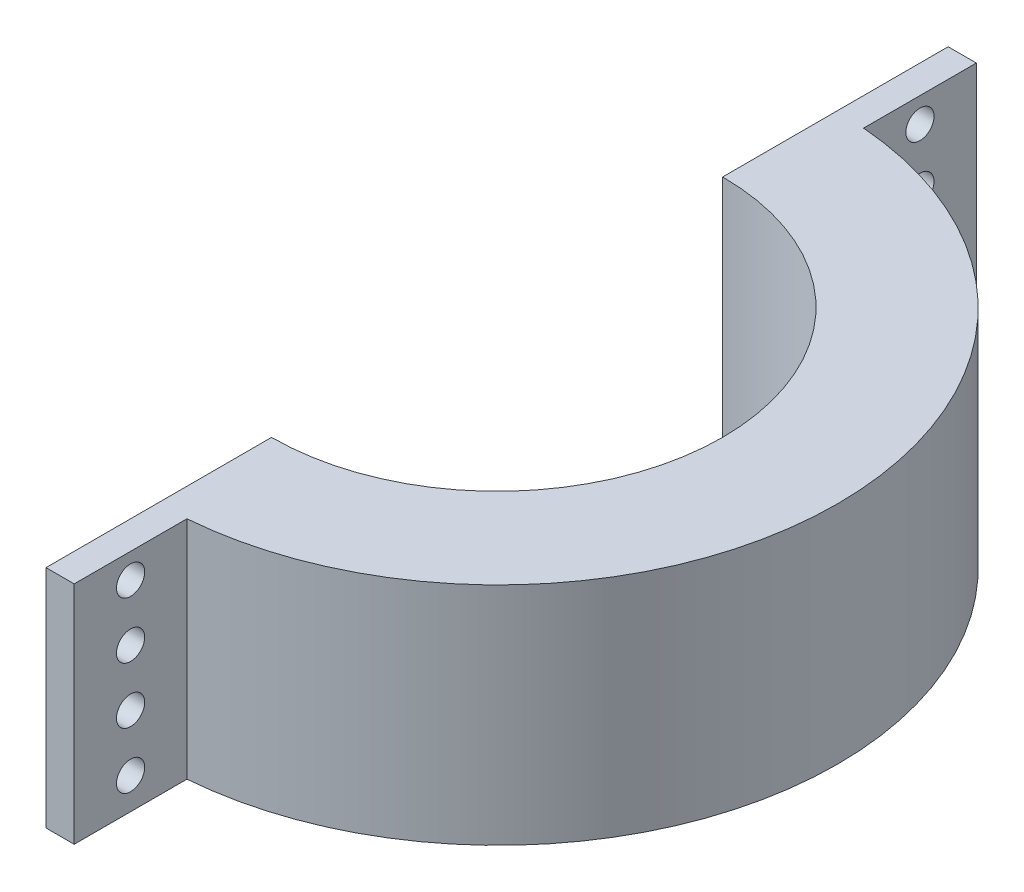
ISO-10303-21;
HEADER;
FILE_DESCRIPTION(('STEP AP214'),'2;1');
FILE_NAME('part.step','',(''),(''),'','','');
FILE_SCHEMA(('AUTOMOTIVE_DESIGN { 1 0 10303 214 1 1 1 1 }'));
ENDSEC;
DATA;
#1=APPLICATION_CONTEXT('core data for automotive mechanical design processes');
#2=APPLICATION_PROTOCOL_DEFINITION('international standard','automotive_design',2000,#1);
#3=PRODUCT_CONTEXT('',#1,'mechanical');
#4=PRODUCT('Part','Part','',(#3));
#5=PRODUCT_RELATED_PRODUCT_CATEGORY('part','',(#4));
#6=PRODUCT_DEFINITION_FORMATION('','',#4);
#7=PRODUCT_DEFINITION_CONTEXT('part definition',#1,'design');
#8=PRODUCT_DEFINITION('design','',#6,#7);
#9=PRODUCT_DEFINITION_SHAPE('','',#8);
#10=(LENGTH_UNIT() NAMED_UNIT(*) SI_UNIT(.MILLI.,.METRE.));
#11=(NAMED_UNIT(*) PLANE_ANGLE_UNIT() SI_UNIT($,.RADIAN.));
#12=(NAMED_UNIT(*) SI_UNIT($,.STERADIAN.) SOLID_ANGLE_UNIT());
#13=UNCERTAINTY_MEASURE_WITH_UNIT(LENGTH_MEASURE(1.E-05),#10,'distance_accuracy_value','');
#14=(GEOMETRIC_REPRESENTATION_CONTEXT(3) GLOBAL_UNCERTAINTY_ASSIGNED_CONTEXT((#13)) GLOBAL_UNIT_ASSIGNED_CONTEXT((#10,
#11,#12)) REPRESENTATION_CONTEXT('',''));
#15=CARTESIAN_POINT('',(0.,0.,0.));
#16=DIRECTION('',(0.,0.,1.));
#17=DIRECTION('',(1.,0.,0.));
#18=AXIS2_PLACEMENT_3D('',#15,#16,#17);
#19=CARTESIAN_POINT('',(0.,101.6,0.));
#20=DIRECTION('',(0.,-1.,0.));
#21=DIRECTION('',(0.,0.,-1.));
#22=AXIS2_PLACEMENT_3D('',#19,#20,#21);
#23=CYLINDRICAL_SURFACE('',#22,101.6);
#24=CARTESIAN_POINT('',(0.,0.,0.));
#25=DIRECTION('',(0.,-1.,0.));
#26=DIRECTION('',(0.,0.,-1.));
#27=AXIS2_PLACEMENT_3D('',#24,#25,#26);
#28=CIRCLE('',#27,101.6);
#29=CARTESIAN_POINT('',(0.,0.,-101.6));
#30=VERTEX_POINT('',#29);
#31=CARTESIAN_POINT('',(0.,0.,101.6));
#32=VERTEX_POINT('',#31);
#33=EDGE_CURVE('E132',#30,#32,#28,.T.);
#34=ORIENTED_EDGE('',*,*,#33,.T.);
#35=DIRECTION('',(0.,-1.,0.));
#36=VECTOR('',#35,1.);
#37=CARTESIAN_POINT('',(0.,101.6,101.6));
#38=LINE('',#37,#36);
#39=CARTESIAN_POINT('',(0.,101.6,101.6));
#40=VERTEX_POINT('',#39);
#41=EDGE_CURVE('E11',#40,#32,#38,.T.);
#42=ORIENTED_EDGE('',*,*,#41,.F.);
#43=CARTESIAN_POINT('',(0.,101.6,0.));
#44=DIRECTION('',(0.,-1.,0.));
#45=DIRECTION('',(0.,0.,-1.));
#46=AXIS2_PLACEMENT_3D('',#43,#44,#45);
#47=CIRCLE('',#46,101.6);
#48=CARTESIAN_POINT('',(0.,101.6,-101.6));
#49=VERTEX_POINT('',#48);
#50=EDGE_CURVE('E147',#49,#40,#47,.T.);
#51=ORIENTED_EDGE('',*,*,#50,.F.);
#52=DIRECTION('',(0.,-1.,0.));
#53=VECTOR('',#52,1.);
#54=CARTESIAN_POINT('',(0.,101.6,-101.6));
#55=LINE('',#54,#53);
#56=EDGE_CURVE('E128',#49,#30,#55,.T.);
#57=ORIENTED_EDGE('',*,*,#56,.T.);
#58=EDGE_LOOP('',(#34,#42,#51,#57));
#59=FACE_BOUND('',#58,.T.);
#60=ADVANCED_FACE('F36',(#59),#23,.F.);
#61=CARTESIAN_POINT('',(0.,101.6,101.6));
#62=DIRECTION('',(1.,0.,0.));
#63=DIRECTION('',(0.,0.,-1.));
#64=AXIS2_PLACEMENT_3D('',#61,#62,#63);
#65=PLANE('',#64);
#66=CARTESIAN_POINT('',(0.,14.1803216621523,177.799999999999));
#67=DIRECTION('',(1.,0.,0.));
#68=DIRECTION('',(0.,0.,-1.));
#69=AXIS2_PLACEMENT_3D('',#66,#67,#68);
#70=CIRCLE('',#69,6.34999999999999);
#71=CARTESIAN_POINT('',(0.,14.1803216621523,171.449999999999));
#72=VERTEX_POINT('',#71);
#73=EDGE_CURVE('E195',#72,#72,#70,.T.);
#74=ORIENTED_EDGE('',*,*,#73,.T.);
#75=EDGE_LOOP('',(#74));
#76=FACE_BOUND('',#75,.T.);
#77=CARTESIAN_POINT('',(0.,39.5803216621523,177.799999999999));
#78=DIRECTION('',(1.,0.,0.));
#79=DIRECTION('',(0.,0.,-1.));
#80=AXIS2_PLACEMENT_3D('',#77,#78,#79);
#81=CIRCLE('',#80,6.34999999999999);
#82=CARTESIAN_POINT('',(0.,39.5803216621523,171.449999999999));
#83=VERTEX_POINT('',#82);
#84=EDGE_CURVE('E189',#83,#83,#81,.T.);
#85=ORIENTED_EDGE('',*,*,#84,.T.);
#86=EDGE_LOOP('',(#85));
#87=FACE_BOUND('',#86,.T.);
#88=CARTESIAN_POINT('',(0.,64.9803216621523,177.8));
#89=DIRECTION('',(1.,0.,0.));
#90=DIRECTION('',(0.,0.,-1.));
#91=AXIS2_PLACEMENT_3D('',#88,#89,#90);
#92=CIRCLE('',#91,6.34999999999999);
#93=CARTESIAN_POINT('',(0.,64.9803216621523,171.45));
#94=VERTEX_POINT('',#93);
#95=EDGE_CURVE('E183',#94,#94,#92,.T.);
#96=ORIENTED_EDGE('',*,*,#95,.T.);
#97=EDGE_LOOP('',(#96));
#98=FACE_BOUND('',#97,.T.);
#99=CARTESIAN_POINT('',(0.,90.3803216621523,177.8));
#100=DIRECTION('',(1.,0.,0.));
#101=DIRECTION('',(0.,0.,-1.));
#102=AXIS2_PLACEMENT_3D('',#99,#100,#101);
#103=CIRCLE('',#102,6.34999999999999);
#104=CARTESIAN_POINT('',(0.,90.3803216621523,171.45));
#105=VERTEX_POINT('',#104);
#106=EDGE_CURVE('E136',#105,#105,#103,.T.);
#107=ORIENTED_EDGE('',*,*,#106,.T.);
#108=EDGE_LOOP('',(#107));
#109=FACE_BOUND('',#108,.T.);
#110=DIRECTION('',(0.,0.,1.));
#111=VECTOR('',#110,1.);
#112=CARTESIAN_POINT('',(0.,0.,101.6));
#113=LINE('',#112,#111);
#114=CARTESIAN_POINT('',(0.,0.,203.2));
#115=VERTEX_POINT('',#114);
#116=EDGE_CURVE('E135',#32,#115,#113,.T.);
#117=ORIENTED_EDGE('',*,*,#116,.T.);
#118=DIRECTION('',(0.,-1.,0.));
#119=VECTOR('',#118,1.);
#120=CARTESIAN_POINT('',(0.,101.6,203.2));
#121=LINE('',#120,#119);
#122=CARTESIAN_POINT('',(0.,101.6,203.2));
#123=VERTEX_POINT('',#122);
#124=EDGE_CURVE('E44',#123,#115,#121,.T.);
#125=ORIENTED_EDGE('',*,*,#124,.F.);
#126=DIRECTION('',(0.,0.,1.));
#127=VECTOR('',#126,1.);
#128=CARTESIAN_POINT('',(0.,101.6,101.6));
#129=LINE('',#128,#127);
#130=EDGE_CURVE('E95',#40,#123,#129,.T.);
#131=ORIENTED_EDGE('',*,*,#130,.F.);
#132=ORIENTED_EDGE('',*,*,#41,.T.);
#133=EDGE_LOOP('',(#117,#125,#131,#132));
#134=FACE_BOUND('',#133,.T.);
#135=ADVANCED_FACE('F264',(#76,#87,#98,#109,#134),#65,.F.);
#136=CARTESIAN_POINT('',(0.,101.6,203.2));
#137=DIRECTION('',(0.,0.,-1.));
#138=DIRECTION('',(-1.,0.,0.));
#139=AXIS2_PLACEMENT_3D('',#136,#137,#138);
#140=PLANE('',#139);
#141=DIRECTION('',(1.,0.,0.));
#142=VECTOR('',#141,1.);
#143=CARTESIAN_POINT('',(0.,0.,203.2));
#144=LINE('',#143,#142);
#145=CARTESIAN_POINT('',(12.7,0.,203.2));
#146=VERTEX_POINT('',#145);
#147=EDGE_CURVE('E138',#115,#146,#144,.T.);
#148=ORIENTED_EDGE('',*,*,#147,.T.);
#149=DIRECTION('',(0.,-1.,0.));
#150=VECTOR('',#149,1.);
#151=CARTESIAN_POINT('',(12.7,101.6,203.2));
#152=LINE('',#151,#150);
#153=CARTESIAN_POINT('',(12.7,101.6,203.2));
#154=VERTEX_POINT('',#153);
#155=EDGE_CURVE('E154',#154,#146,#152,.T.);
#156=ORIENTED_EDGE('',*,*,#155,.F.);
#157=DIRECTION('',(1.,0.,0.));
#158=VECTOR('',#157,1.);
#159=CARTESIAN_POINT('',(0.,101.6,203.2));
#160=LINE('',#159,#158);
#161=EDGE_CURVE('E162',#123,#154,#160,.T.);
#162=ORIENTED_EDGE('',*,*,#161,.F.);
#163=ORIENTED_EDGE('',*,*,#124,.T.);
#164=EDGE_LOOP('',(#148,#156,#162,#163));
#165=FACE_BOUND('',#164,.T.);
#166=ADVANCED_FACE('F160',(#165),#140,.F.);
#167=CARTESIAN_POINT('',(12.7,101.6,203.2));
#168=DIRECTION('',(-1.,0.,0.));
#169=DIRECTION('',(0.,0.,1.));
#170=AXIS2_PLACEMENT_3D('',#167,#168,#169);
#171=PLANE('',#170);
#172=CARTESIAN_POINT('',(12.7,14.1803216621523,177.799999999999));
#173=DIRECTION('',(1.,0.,0.));
#174=DIRECTION('',(0.,0.,-1.));
#175=AXIS2_PLACEMENT_3D('',#172,#173,#174);
#176=CIRCLE('',#175,6.34999999999999);
#177=CARTESIAN_POINT('',(12.7,14.1803216621523,171.449999999999));
#178=VERTEX_POINT('',#177);
#179=EDGE_CURVE('E198',#178,#178,#176,.T.);
#180=ORIENTED_EDGE('',*,*,#179,.F.);
#181=EDGE_LOOP('',(#180));
#182=FACE_BOUND('',#181,.T.);
#183=CARTESIAN_POINT('',(12.7,39.5803216621523,177.799999999999));
#184=DIRECTION('',(1.,0.,0.));
#185=DIRECTION('',(0.,0.,-1.));
#186=AXIS2_PLACEMENT_3D('',#183,#184,#185);
#187=CIRCLE('',#186,6.34999999999999);
#188=CARTESIAN_POINT('',(12.7,39.5803216621523,171.449999999999));
#189=VERTEX_POINT('',#188);
#190=EDGE_CURVE('E192',#189,#189,#187,.T.);
#191=ORIENTED_EDGE('',*,*,#190,.F.);
#192=EDGE_LOOP('',(#191));
#193=FACE_BOUND('',#192,.T.);
#194=CARTESIAN_POINT('',(12.7,64.9803216621523,177.8));
#195=DIRECTION('',(1.,0.,0.));
#196=DIRECTION('',(0.,0.,-1.));
#197=AXIS2_PLACEMENT_3D('',#194,#195,#196);
#198=CIRCLE('',#197,6.34999999999999);
#199=CARTESIAN_POINT('',(12.7,64.9803216621523,171.45));
#200=VERTEX_POINT('',#199);
#201=EDGE_CURVE('E186',#200,#200,#198,.T.);
#202=ORIENTED_EDGE('',*,*,#201,.F.);
#203=EDGE_LOOP('',(#202));
#204=FACE_BOUND('',#203,.T.);
#205=CARTESIAN_POINT('',(12.7,90.3803216621523,177.8));
#206=DIRECTION('',(1.,0.,0.));
#207=DIRECTION('',(0.,0.,-1.));
#208=AXIS2_PLACEMENT_3D('',#205,#206,#207);
#209=CIRCLE('',#208,6.34999999999999);
#210=CARTESIAN_POINT('',(12.7,90.3803216621523,171.45));
#211=VERTEX_POINT('',#210);
#212=EDGE_CURVE('E180',#211,#211,#209,.T.);
#213=ORIENTED_EDGE('',*,*,#212,.F.);
#214=EDGE_LOOP('',(#213));
#215=FACE_BOUND('',#214,.T.);
#216=DIRECTION('',(0.,0.,-1.));
#217=VECTOR('',#216,1.);
#218=CARTESIAN_POINT('',(12.7,0.,203.2));
#219=LINE('',#218,#217);
#220=CARTESIAN_POINT('',(12.7,0.,152.4));
#221=VERTEX_POINT('',#220);
#222=EDGE_CURVE('E140',#146,#221,#219,.T.);
#223=ORIENTED_EDGE('',*,*,#222,.T.);
#224=DIRECTION('',(0.,-1.,0.));
#225=VECTOR('',#224,1.);
#226=CARTESIAN_POINT('',(12.7,101.6,152.4));
#227=LINE('',#226,#225);
#228=CARTESIAN_POINT('',(12.7,101.6,152.4));
#229=VERTEX_POINT('',#228);
#230=EDGE_CURVE('E151',#229,#221,#227,.T.);
#231=ORIENTED_EDGE('',*,*,#230,.F.);
#232=DIRECTION('',(0.,0.,-1.));
#233=VECTOR('',#232,1.);
#234=CARTESIAN_POINT('',(12.7,101.6,203.2));
#235=LINE('',#234,#233);
#236=EDGE_CURVE('E174',#154,#229,#235,.T.);
#237=ORIENTED_EDGE('',*,*,#236,.F.);
#238=ORIENTED_EDGE('',*,*,#155,.T.);
#239=EDGE_LOOP('',(#223,#231,#237,#238));
#240=FACE_BOUND('',#239,.T.);
#241=ADVANCED_FACE('F170',(#182,#193,#204,#215,#240),#171,.F.);
#242=CARTESIAN_POINT('',(0.517193605257081,101.6,0.));
#243=DIRECTION('',(0.,-1.,0.));
#244=DIRECTION('',(0.,0.,-1.));
#245=AXIS2_PLACEMENT_3D('',#242,#243,#244);
#246=CYLINDRICAL_SURFACE('',#245,152.886169327548);
#247=CARTESIAN_POINT('',(0.517193605257081,0.,0.));
#248=DIRECTION('',(0.,1.,0.));
#249=DIRECTION('',(0.,0.,-1.));
#250=AXIS2_PLACEMENT_3D('',#247,#248,#249);
#251=CIRCLE('',#250,152.886169327548);
#252=CARTESIAN_POINT('',(12.7,0.,-152.4));
#253=VERTEX_POINT('',#252);
#254=EDGE_CURVE('E142',#221,#253,#251,.T.);
#255=ORIENTED_EDGE('',*,*,#254,.T.);
#256=DIRECTION('',(0.,-1.,0.));
#257=VECTOR('',#256,1.);
#258=CARTESIAN_POINT('',(12.7,101.6,-152.4));
#259=LINE('',#258,#257);
#260=CARTESIAN_POINT('',(12.7,101.6,-152.4));
#261=VERTEX_POINT('',#260);
#262=EDGE_CURVE('E123',#261,#253,#259,.T.);
#263=ORIENTED_EDGE('',*,*,#262,.F.);
#264=CARTESIAN_POINT('',(0.517193605257081,101.6,0.));
#265=DIRECTION('',(0.,1.,0.));
#266=DIRECTION('',(0.,0.,-1.));
#267=AXIS2_PLACEMENT_3D('',#264,#265,#266);
#268=CIRCLE('',#267,152.886169327548);
#269=EDGE_CURVE('E114',#229,#261,#268,.T.);
#270=ORIENTED_EDGE('',*,*,#269,.F.);
#271=ORIENTED_EDGE('',*,*,#230,.T.);
#272=EDGE_LOOP('',(#255,#263,#270,#271));
#273=FACE_BOUND('',#272,.T.);
#274=ADVANCED_FACE('F173',(#273),#246,.T.);
#275=CARTESIAN_POINT('',(12.7,101.6,-203.2));
#276=DIRECTION('',(-1.,0.,0.));
#277=DIRECTION('',(0.,0.,1.));
#278=AXIS2_PLACEMENT_3D('',#275,#276,#277);
#279=PLANE('',#278);
#280=CARTESIAN_POINT('',(12.7,14.1803216621523,-177.800000000001));
#281=DIRECTION('',(1.,0.,0.));
#282=DIRECTION('',(0.,0.,-1.));
#283=AXIS2_PLACEMENT_3D('',#280,#281,#282);
#284=CIRCLE('',#283,6.34999999999999);
#285=CARTESIAN_POINT('',(12.7,14.1803216621523,-184.150000000001));
#286=VERTEX_POINT('',#285);
#287=EDGE_CURVE('E222',#286,#286,#284,.T.);
#288=ORIENTED_EDGE('',*,*,#287,.F.);
#289=EDGE_LOOP('',(#288));
#290=FACE_BOUND('',#289,.T.);
#291=CARTESIAN_POINT('',(12.7,39.5803216621523,-177.800000000001));
#292=DIRECTION('',(1.,0.,0.));
#293=DIRECTION('',(0.,0.,-1.));
#294=AXIS2_PLACEMENT_3D('',#291,#292,#293);
#295=CIRCLE('',#294,6.34999999999999);
#296=CARTESIAN_POINT('',(12.7,39.5803216621523,-184.150000000001));
#297=VERTEX_POINT('',#296);
#298=EDGE_CURVE('E216',#297,#297,#295,.T.);
#299=ORIENTED_EDGE('',*,*,#298,.F.);
#300=EDGE_LOOP('',(#299));
#301=FACE_BOUND('',#300,.T.);
#302=CARTESIAN_POINT('',(12.7,64.9803216621523,-177.8));
#303=DIRECTION('',(1.,0.,0.));
#304=DIRECTION('',(0.,0.,-1.));
#305=AXIS2_PLACEMENT_3D('',#302,#303,#304);
#306=CIRCLE('',#305,6.34999999999999);
#307=CARTESIAN_POINT('',(12.7,64.9803216621523,-184.15));
#308=VERTEX_POINT('',#307);
#309=EDGE_CURVE('E210',#308,#308,#306,.T.);
#310=ORIENTED_EDGE('',*,*,#309,.F.);
#311=EDGE_LOOP('',(#310));
#312=FACE_BOUND('',#311,.T.);
#313=CARTESIAN_POINT('',(12.7,90.3803216621523,-177.8));
#314=DIRECTION('',(1.,0.,0.));
#315=DIRECTION('',(0.,0.,-1.));
#316=AXIS2_PLACEMENT_3D('',#313,#314,#315);
#317=CIRCLE('',#316,6.34999999999999);
#318=CARTESIAN_POINT('',(12.7,90.3803216621523,-184.15));
#319=VERTEX_POINT('',#318);
#320=EDGE_CURVE('E204',#319,#319,#317,.T.);
#321=ORIENTED_EDGE('',*,*,#320,.F.);
#322=EDGE_LOOP('',(#321));
#323=FACE_BOUND('',#322,.T.);
#324=DIRECTION('',(0.,0.,-1.));
#325=VECTOR('',#324,1.);
#326=CARTESIAN_POINT('',(12.7,0.,-203.2));
#327=LINE('',#326,#325);
#328=CARTESIAN_POINT('',(12.7,0.,-203.2));
#329=VERTEX_POINT('',#328);
#330=EDGE_CURVE('E122',#253,#329,#327,.T.);
#331=ORIENTED_EDGE('',*,*,#330,.T.);
#332=DIRECTION('',(0.,-1.,0.));
#333=VECTOR('',#332,1.);
#334=CARTESIAN_POINT('',(12.7,101.6,-203.2));
#335=LINE('',#334,#333);
#336=CARTESIAN_POINT('',(12.7,101.6,-203.2));
#337=VERTEX_POINT('',#336);
#338=EDGE_CURVE('E119',#337,#329,#335,.T.);
#339=ORIENTED_EDGE('',*,*,#338,.F.);
#340=DIRECTION('',(0.,0.,-1.));
#341=VECTOR('',#340,1.);
#342=CARTESIAN_POINT('',(12.7,101.6,-203.2));
#343=LINE('',#342,#341);
#344=EDGE_CURVE('E108',#261,#337,#343,.T.);
#345=ORIENTED_EDGE('',*,*,#344,.F.);
#346=ORIENTED_EDGE('',*,*,#262,.T.);
#347=EDGE_LOOP('',(#331,#339,#345,#346));
#348=FACE_BOUND('',#347,.T.);
#349=ADVANCED_FACE('F120',(#290,#301,#312,#323,#348),#279,.F.);
#350=CARTESIAN_POINT('',(0.,101.6,-203.2));
#351=DIRECTION('',(0.,0.,1.));
#352=DIRECTION('',(1.,0.,0.));
#353=AXIS2_PLACEMENT_3D('',#350,#351,#352);
#354=PLANE('',#353);
#355=DIRECTION('',(-1.,0.,0.));
#356=VECTOR('',#355,1.);
#357=CARTESIAN_POINT('',(0.,0.,-203.2));
#358=LINE('',#357,#356);
#359=CARTESIAN_POINT('',(0.,0.,-203.2));
#360=VERTEX_POINT('',#359);
#361=EDGE_CURVE('E81',#329,#360,#358,.T.);
#362=ORIENTED_EDGE('',*,*,#361,.T.);
#363=DIRECTION('',(0.,-1.,0.));
#364=VECTOR('',#363,1.);
#365=CARTESIAN_POINT('',(0.,101.6,-203.2));
#366=LINE('',#365,#364);
#367=CARTESIAN_POINT('',(0.,101.6,-203.2));
#368=VERTEX_POINT('',#367);
#369=EDGE_CURVE('E124',#368,#360,#366,.T.);
#370=ORIENTED_EDGE('',*,*,#369,.F.);
#371=DIRECTION('',(-1.,0.,0.));
#372=VECTOR('',#371,1.);
#373=CARTESIAN_POINT('',(0.,101.6,-203.2));
#374=LINE('',#373,#372);
#375=EDGE_CURVE('E112',#337,#368,#374,.T.);
#376=ORIENTED_EDGE('',*,*,#375,.F.);
#377=ORIENTED_EDGE('',*,*,#338,.T.);
#378=EDGE_LOOP('',(#362,#370,#376,#377));
#379=FACE_BOUND('',#378,.T.);
#380=ADVANCED_FACE('F126',(#379),#354,.F.);
#381=CARTESIAN_POINT('',(0.,101.6,-101.6));
#382=DIRECTION('',(1.,0.,0.));
#383=DIRECTION('',(0.,0.,-1.));
#384=AXIS2_PLACEMENT_3D('',#381,#382,#383);
#385=PLANE('',#384);
#386=CARTESIAN_POINT('',(0.,14.1803216621523,-177.800000000001));
#387=DIRECTION('',(1.,0.,0.));
#388=DIRECTION('',(0.,0.,-1.));
#389=AXIS2_PLACEMENT_3D('',#386,#387,#388);
#390=CIRCLE('',#389,6.34999999999999);
#391=CARTESIAN_POINT('',(0.,14.1803216621523,-184.150000000001));
#392=VERTEX_POINT('',#391);
#393=EDGE_CURVE('E219',#392,#392,#390,.T.);
#394=ORIENTED_EDGE('',*,*,#393,.T.);
#395=EDGE_LOOP('',(#394));
#396=FACE_BOUND('',#395,.T.);
#397=CARTESIAN_POINT('',(0.,39.5803216621523,-177.800000000001));
#398=DIRECTION('',(1.,0.,0.));
#399=DIRECTION('',(0.,0.,-1.));
#400=AXIS2_PLACEMENT_3D('',#397,#398,#399);
#401=CIRCLE('',#400,6.34999999999999);
#402=CARTESIAN_POINT('',(0.,39.5803216621523,-184.150000000001));
#403=VERTEX_POINT('',#402);
#404=EDGE_CURVE('E213',#403,#403,#401,.T.);
#405=ORIENTED_EDGE('',*,*,#404,.T.);
#406=EDGE_LOOP('',(#405));
#407=FACE_BOUND('',#406,.T.);
#408=CARTESIAN_POINT('',(0.,64.9803216621523,-177.8));
#409=DIRECTION('',(1.,0.,0.));
#410=DIRECTION('',(0.,0.,-1.));
#411=AXIS2_PLACEMENT_3D('',#408,#409,#410);
#412=CIRCLE('',#411,6.34999999999999);
#413=CARTESIAN_POINT('',(0.,64.9803216621523,-184.15));
#414=VERTEX_POINT('',#413);
#415=EDGE_CURVE('E207',#414,#414,#412,.T.);
#416=ORIENTED_EDGE('',*,*,#415,.T.);
#417=EDGE_LOOP('',(#416));
#418=FACE_BOUND('',#417,.T.);
#419=CARTESIAN_POINT('',(0.,90.3803216621523,-177.8));
#420=DIRECTION('',(1.,0.,0.));
#421=DIRECTION('',(0.,0.,-1.));
#422=AXIS2_PLACEMENT_3D('',#419,#420,#421);
#423=CIRCLE('',#422,6.34999999999999);
#424=CARTESIAN_POINT('',(0.,90.3803216621523,-184.15));
#425=VERTEX_POINT('',#424);
#426=EDGE_CURVE('E201',#425,#425,#423,.T.);
#427=ORIENTED_EDGE('',*,*,#426,.T.);
#428=EDGE_LOOP('',(#427));
#429=FACE_BOUND('',#428,.T.);
#430=DIRECTION('',(0.,0.,1.));
#431=VECTOR('',#430,1.);
#432=CARTESIAN_POINT('',(0.,0.,-101.6));
#433=LINE('',#432,#431);
#434=EDGE_CURVE('E87',#360,#30,#433,.T.);
#435=ORIENTED_EDGE('',*,*,#434,.T.);
#436=ORIENTED_EDGE('',*,*,#56,.F.);
#437=DIRECTION('',(0.,0.,1.));
#438=VECTOR('',#437,1.);
#439=CARTESIAN_POINT('',(0.,101.6,-101.6));
#440=LINE('',#439,#438);
#441=EDGE_CURVE('E52',#368,#49,#440,.T.);
#442=ORIENTED_EDGE('',*,*,#441,.F.);
#443=ORIENTED_EDGE('',*,*,#369,.T.);
#444=EDGE_LOOP('',(#435,#436,#442,#443));
#445=FACE_BOUND('',#444,.T.);
#446=ADVANCED_FACE('F228',(#396,#407,#418,#429,#445),#385,.F.);
#447=CARTESIAN_POINT('',(0.,101.6,0.));
#448=DIRECTION('',(0.,-1.,0.));
#449=DIRECTION('',(0.,0.,-1.));
#450=AXIS2_PLACEMENT_3D('',#447,#448,#449);
#451=PLANE('',#450);
#452=ORIENTED_EDGE('',*,*,#50,.T.);
#453=ORIENTED_EDGE('',*,*,#130,.T.);
#454=ORIENTED_EDGE('',*,*,#161,.T.);
#455=ORIENTED_EDGE('',*,*,#236,.T.);
#456=ORIENTED_EDGE('',*,*,#269,.T.);
#457=ORIENTED_EDGE('',*,*,#344,.T.);
#458=ORIENTED_EDGE('',*,*,#375,.T.);
#459=ORIENTED_EDGE('',*,*,#441,.T.);
#460=EDGE_LOOP('',(#452,#453,#454,#455,#456,#457,#458,#459));
#461=FACE_BOUND('',#460,.T.);
#462=ADVANCED_FACE('F110',(#461),#451,.F.);
#463=CARTESIAN_POINT('',(0.,0.,0.));
#464=DIRECTION('',(0.,-1.,0.));
#465=DIRECTION('',(0.,0.,-1.));
#466=AXIS2_PLACEMENT_3D('',#463,#464,#465);
#467=PLANE('',#466);
#468=ORIENTED_EDGE('',*,*,#33,.F.);
#469=ORIENTED_EDGE('',*,*,#434,.F.);
#470=ORIENTED_EDGE('',*,*,#361,.F.);
#471=ORIENTED_EDGE('',*,*,#330,.F.);
#472=ORIENTED_EDGE('',*,*,#254,.F.);
#473=ORIENTED_EDGE('',*,*,#222,.F.);
#474=ORIENTED_EDGE('',*,*,#147,.F.);
#475=ORIENTED_EDGE('',*,*,#116,.F.);
#476=EDGE_LOOP('',(#468,#469,#470,#471,#472,#473,#474,#475));
#477=FACE_BOUND('',#476,.T.);
#478=ADVANCED_FACE('F166',(#477),#467,.T.);
#479=CARTESIAN_POINT('',(0.,90.3803216621523,177.8));
#480=DIRECTION('',(1.,0.,0.));
#481=DIRECTION('',(0.,0.,-1.));
#482=AXIS2_PLACEMENT_3D('',#479,#480,#481);
#483=CYLINDRICAL_SURFACE('',#482,6.34999999999999);
#484=ORIENTED_EDGE('',*,*,#106,.F.);
#485=EDGE_LOOP('',(#484));
#486=FACE_BOUND('',#485,.T.);
#487=ORIENTED_EDGE('',*,*,#212,.T.);
#488=EDGE_LOOP('',(#487));
#489=FACE_BOUND('',#488,.T.);
#490=ADVANCED_FACE('F325',(#486,#489),#483,.F.);
#491=CARTESIAN_POINT('',(0.,64.9803216621523,177.8));
#492=DIRECTION('',(1.,0.,0.));
#493=DIRECTION('',(0.,0.,-1.));
#494=AXIS2_PLACEMENT_3D('',#491,#492,#493);
#495=CYLINDRICAL_SURFACE('',#494,6.34999999999999);
#496=ORIENTED_EDGE('',*,*,#95,.F.);
#497=EDGE_LOOP('',(#496));
#498=FACE_BOUND('',#497,.T.);
#499=ORIENTED_EDGE('',*,*,#201,.T.);
#500=EDGE_LOOP('',(#499));
#501=FACE_BOUND('',#500,.T.);
#502=ADVANCED_FACE('F349',(#498,#501),#495,.F.);
#503=CARTESIAN_POINT('',(0.,39.5803216621523,177.799999999999));
#504=DIRECTION('',(1.,0.,0.));
#505=DIRECTION('',(0.,0.,-1.));
#506=AXIS2_PLACEMENT_3D('',#503,#504,#505);
#507=CYLINDRICAL_SURFACE('',#506,6.34999999999999);
#508=ORIENTED_EDGE('',*,*,#84,.F.);
#509=EDGE_LOOP('',(#508));
#510=FACE_BOUND('',#509,.T.);
#511=ORIENTED_EDGE('',*,*,#190,.T.);
#512=EDGE_LOOP('',(#511));
#513=FACE_BOUND('',#512,.T.);
#514=ADVANCED_FACE('F259',(#510,#513),#507,.F.);
#515=CARTESIAN_POINT('',(0.,14.1803216621523,177.799999999999));
#516=DIRECTION('',(1.,0.,0.));
#517=DIRECTION('',(0.,0.,-1.));
#518=AXIS2_PLACEMENT_3D('',#515,#516,#517);
#519=CYLINDRICAL_SURFACE('',#518,6.34999999999999);
#520=ORIENTED_EDGE('',*,*,#73,.F.);
#521=EDGE_LOOP('',(#520));
#522=FACE_BOUND('',#521,.T.);
#523=ORIENTED_EDGE('',*,*,#179,.T.);
#524=EDGE_LOOP('',(#523));
#525=FACE_BOUND('',#524,.T.);
#526=ADVANCED_FACE('F250',(#522,#525),#519,.F.);
#527=CARTESIAN_POINT('',(0.,90.3803216621523,-177.8));
#528=DIRECTION('',(1.,0.,0.));
#529=DIRECTION('',(0.,0.,-1.));
#530=AXIS2_PLACEMENT_3D('',#527,#528,#529);
#531=CYLINDRICAL_SURFACE('',#530,6.34999999999999);
#532=ORIENTED_EDGE('',*,*,#426,.F.);
#533=EDGE_LOOP('',(#532));
#534=FACE_BOUND('',#533,.T.);
#535=ORIENTED_EDGE('',*,*,#320,.T.);
#536=EDGE_LOOP('',(#535));
#537=FACE_BOUND('',#536,.T.);
#538=ADVANCED_FACE('F247',(#534,#537),#531,.F.);
#539=CARTESIAN_POINT('',(0.,64.9803216621523,-177.8));
#540=DIRECTION('',(1.,0.,0.));
#541=DIRECTION('',(0.,0.,-1.));
#542=AXIS2_PLACEMENT_3D('',#539,#540,#541);
#543=CYLINDRICAL_SURFACE('',#542,6.34999999999999);
#544=ORIENTED_EDGE('',*,*,#415,.F.);
#545=EDGE_LOOP('',(#544));
#546=FACE_BOUND('',#545,.T.);
#547=ORIENTED_EDGE('',*,*,#309,.T.);
#548=EDGE_LOOP('',(#547));
#549=FACE_BOUND('',#548,.T.);
#550=ADVANCED_FACE('F249',(#546,#549),#543,.F.);
#551=CARTESIAN_POINT('',(0.,39.5803216621523,-177.800000000001));
#552=DIRECTION('',(1.,0.,0.));
#553=DIRECTION('',(0.,0.,-1.));
#554=AXIS2_PLACEMENT_3D('',#551,#552,#553);
#555=CYLINDRICAL_SURFACE('',#554,6.34999999999999);
#556=ORIENTED_EDGE('',*,*,#404,.F.);
#557=EDGE_LOOP('',(#556));
#558=FACE_BOUND('',#557,.T.);
#559=ORIENTED_EDGE('',*,*,#298,.T.);
#560=EDGE_LOOP('',(#559));
#561=FACE_BOUND('',#560,.T.);
#562=ADVANCED_FACE('F234',(#558,#561),#555,.F.);
#563=CARTESIAN_POINT('',(0.,14.1803216621523,-177.800000000001));
#564=DIRECTION('',(1.,0.,0.));
#565=DIRECTION('',(0.,0.,-1.));
#566=AXIS2_PLACEMENT_3D('',#563,#564,#565);
#567=CYLINDRICAL_SURFACE('',#566,6.34999999999999);
#568=ORIENTED_EDGE('',*,*,#393,.F.);
#569=EDGE_LOOP('',(#568));
#570=FACE_BOUND('',#569,.T.);
#571=ORIENTED_EDGE('',*,*,#287,.T.);
#572=EDGE_LOOP('',(#571));
#573=FACE_BOUND('',#572,.T.);
#574=ADVANCED_FACE('F231',(#570,#573),#567,.F.);
#575=CLOSED_SHELL('',(#60,#135,#166,#241,#274,#349,#380,#446,#462,#478,#490,#502,#514,#526,#538,
#550,#562,#574));
#576=MANIFOLD_SOLID_BREP('B2',#575);
#577=ADVANCED_BREP_SHAPE_REPRESENTATION('',(#18,#576),#14);
#578=SHAPE_DEFINITION_REPRESENTATION(#9,#577);
ENDSEC;
END-ISO-10303-21;
